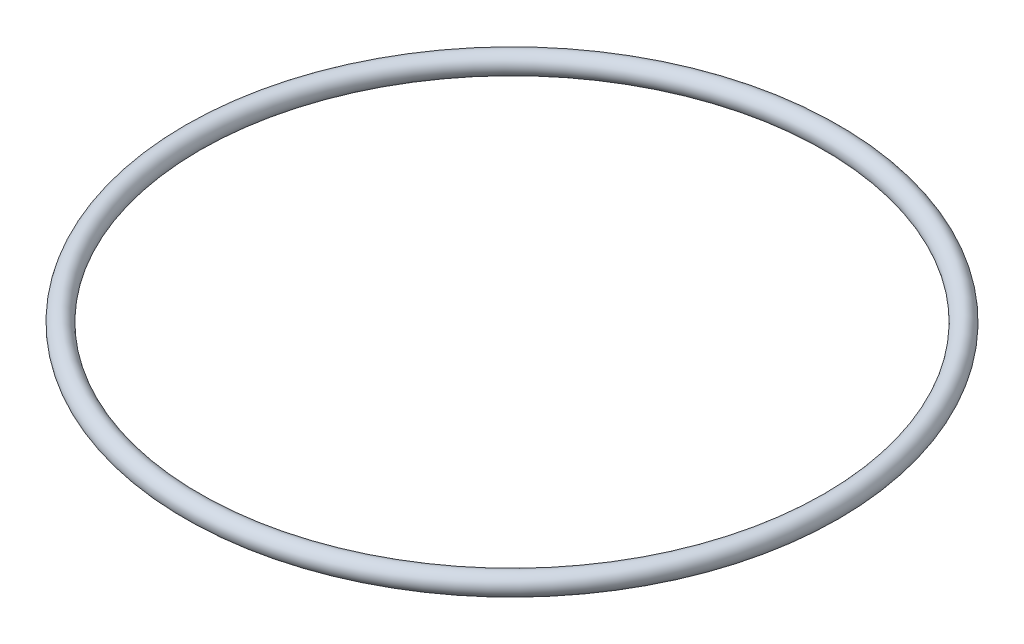
ISO-10303-21;
HEADER;
FILE_DESCRIPTION(('STEP AP214'),'2;1');
FILE_NAME('part.step','',(''),(''),'','','');
FILE_SCHEMA(('AUTOMOTIVE_DESIGN { 1 0 10303 214 1 1 1 1 }'));
ENDSEC;
DATA;
#1=APPLICATION_CONTEXT('core data for automotive mechanical design processes');
#2=APPLICATION_PROTOCOL_DEFINITION('international standard','automotive_design',2000,#1);
#3=PRODUCT_CONTEXT('',#1,'mechanical');
#4=PRODUCT('Part','Part','',(#3));
#5=PRODUCT_RELATED_PRODUCT_CATEGORY('part','',(#4));
#6=PRODUCT_DEFINITION_FORMATION('','',#4);
#7=PRODUCT_DEFINITION_CONTEXT('part definition',#1,'design');
#8=PRODUCT_DEFINITION('design','',#6,#7);
#9=PRODUCT_DEFINITION_SHAPE('','',#8);
#10=(LENGTH_UNIT() NAMED_UNIT(*) SI_UNIT(.MILLI.,.METRE.));
#11=(NAMED_UNIT(*) PLANE_ANGLE_UNIT() SI_UNIT($,.RADIAN.));
#12=(NAMED_UNIT(*) SI_UNIT($,.STERADIAN.) SOLID_ANGLE_UNIT());
#13=UNCERTAINTY_MEASURE_WITH_UNIT(LENGTH_MEASURE(1.E-05),#10,'distance_accuracy_value','');
#14=(GEOMETRIC_REPRESENTATION_CONTEXT(3) GLOBAL_UNCERTAINTY_ASSIGNED_CONTEXT((#13)) GLOBAL_UNIT_ASSIGNED_CONTEXT((#10,
#11,#12)) REPRESENTATION_CONTEXT('',''));
#15=CARTESIAN_POINT('',(0.,0.,0.));
#16=DIRECTION('',(0.,0.,1.));
#17=DIRECTION('',(1.,0.,0.));
#18=AXIS2_PLACEMENT_3D('',#15,#16,#17);
#19=CARTESIAN_POINT('',(0.,0.,0.));
#20=DIRECTION('',(0.,1.,0.));
#21=DIRECTION('',(0.,0.,1.));
#22=AXIS2_PLACEMENT_3D('',#19,#20,#21);
#23=TOROIDAL_SURFACE('',#22,46.83,1.5);
#24=CARTESIAN_POINT('',(-46.83,0.,0.));
#25=DIRECTION('',(0.,0.,1.));
#26=DIRECTION('',(1.,0.,0.));
#27=AXIS2_PLACEMENT_3D('',#24,#25,#26);
#28=CIRCLE('',#27,1.5);
#29=CARTESIAN_POINT('',(-48.33,0.,0.));
#30=VERTEX_POINT('',#29);
#31=EDGE_CURVE('E10',#30,#30,#28,.T.);
#32=CARTESIAN_POINT('',(0.,0.,0.));
#33=DIRECTION('',(0.,1.,0.));
#34=DIRECTION('',(0.,0.,1.));
#35=AXIS2_PLACEMENT_3D('',#32,#33,#34);
#36=CIRCLE('',#35,48.33);
#37=EDGE_CURVE('',#30,#30,#36,.T.);
#38=ORIENTED_EDGE('',*,*,#31,.T.);
#39=ORIENTED_EDGE('',*,*,#31,.F.);
#40=ORIENTED_EDGE('',*,*,#37,.T.);
#41=ORIENTED_EDGE('',*,*,#37,.F.);
#42=EDGE_LOOP('',(#38,#40,#39,#41));
#43=FACE_BOUND('',#42,.T.);
#44=ADVANCED_FACE('F37',(#43),#23,.T.);
#45=CLOSED_SHELL('',(#44));
#46=MANIFOLD_SOLID_BREP('B2',#45);
#47=ADVANCED_BREP_SHAPE_REPRESENTATION('',(#18,#46),#14);
#48=SHAPE_DEFINITION_REPRESENTATION(#9,#47);
ENDSEC;
END-ISO-10303-21;
